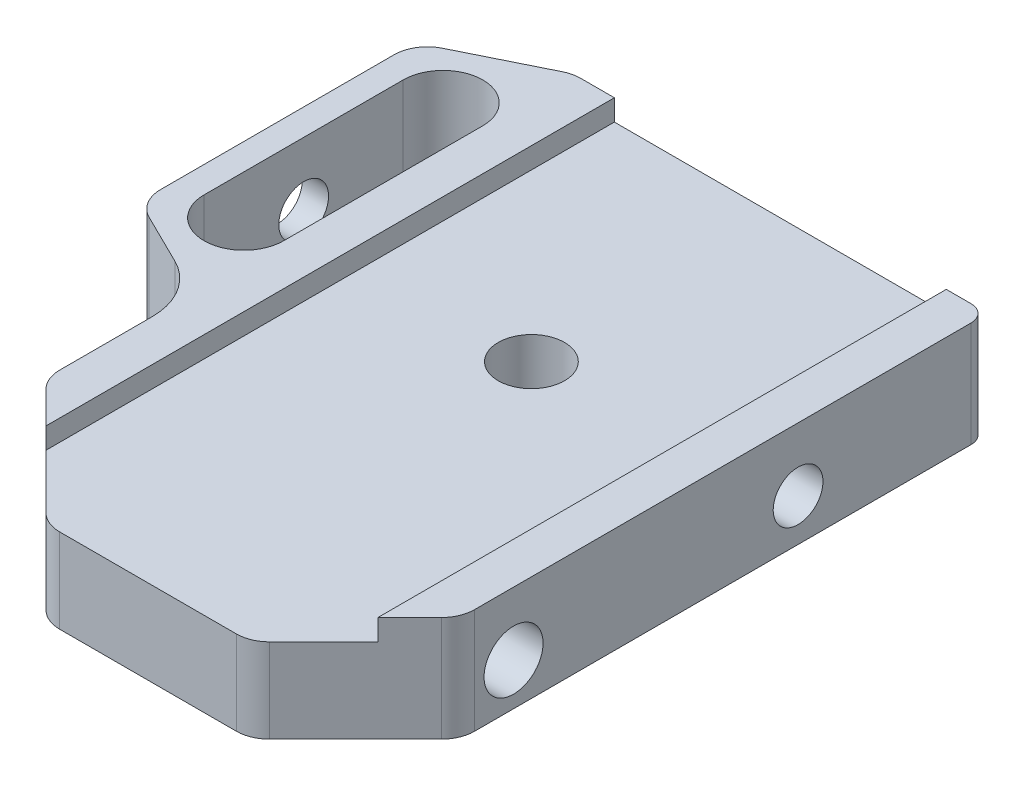
ISO-10303-21;
HEADER;
FILE_DESCRIPTION(('STEP AP214'),'2;1');
FILE_NAME('part.step','',(''),(''),'','','');
FILE_SCHEMA(('AUTOMOTIVE_DESIGN { 1 0 10303 214 1 1 1 1 }'));
ENDSEC;
DATA;
#1=APPLICATION_CONTEXT('core data for automotive mechanical design processes');
#2=APPLICATION_PROTOCOL_DEFINITION('international standard','automotive_design',2000,#1);
#3=PRODUCT_CONTEXT('',#1,'mechanical');
#4=PRODUCT('Part','Part','',(#3));
#5=PRODUCT_RELATED_PRODUCT_CATEGORY('part','',(#4));
#6=PRODUCT_DEFINITION_FORMATION('','',#4);
#7=PRODUCT_DEFINITION_CONTEXT('part definition',#1,'design');
#8=PRODUCT_DEFINITION('design','',#6,#7);
#9=PRODUCT_DEFINITION_SHAPE('','',#8);
#10=(LENGTH_UNIT() NAMED_UNIT(*) SI_UNIT(.MILLI.,.METRE.));
#11=(NAMED_UNIT(*) PLANE_ANGLE_UNIT() SI_UNIT($,.RADIAN.));
#12=(NAMED_UNIT(*) SI_UNIT($,.STERADIAN.) SOLID_ANGLE_UNIT());
#13=UNCERTAINTY_MEASURE_WITH_UNIT(LENGTH_MEASURE(1.E-05),#10,'distance_accuracy_value','');
#14=(GEOMETRIC_REPRESENTATION_CONTEXT(3) GLOBAL_UNCERTAINTY_ASSIGNED_CONTEXT((#13)) GLOBAL_UNIT_ASSIGNED_CONTEXT((#10,
#11,#12)) REPRESENTATION_CONTEXT('',''));
#15=CARTESIAN_POINT('',(0.,0.,0.));
#16=DIRECTION('',(0.,0.,1.));
#17=DIRECTION('',(1.,0.,0.));
#18=AXIS2_PLACEMENT_3D('',#15,#16,#17);
#19=CARTESIAN_POINT('',(0.,5.08,0.));
#20=DIRECTION('',(0.,1.,0.));
#21=DIRECTION('',(0.,0.,1.));
#22=AXIS2_PLACEMENT_3D('',#19,#20,#21);
#23=PLANE('',#22);
#24=CARTESIAN_POINT('',(12.5,5.08,15.));
#25=DIRECTION('',(0.,1.,0.));
#26=DIRECTION('',(0.,0.,1.));
#27=AXIS2_PLACEMENT_3D('',#24,#25,#26);
#28=CIRCLE('',#27,1.99999999999998);
#29=CARTESIAN_POINT('',(12.5,5.08,17.));
#30=VERTEX_POINT('',#29);
#31=EDGE_CURVE('E815',#30,#30,#28,.T.);
#32=ORIENTED_EDGE('',*,*,#31,.F.);
#33=EDGE_LOOP('',(#32));
#34=FACE_BOUND('',#33,.T.);
#35=DIRECTION('',(-0.707106781186549,0.,-0.707106781186546));
#36=VECTOR('',#35,1.);
#37=CARTESIAN_POINT('',(0.,5.08,31.75));
#38=LINE('',#37,#36);
#39=CARTESIAN_POINT('',(5.76421354362795,5.08,37.5142135436279));
#40=VERTEX_POINT('',#39);
#41=CARTESIAN_POINT('',(2.5,5.08,34.25));
#42=VERTEX_POINT('',#41);
#43=EDGE_CURVE('E297',#40,#42,#38,.T.);
#44=ORIENTED_EDGE('',*,*,#43,.F.);
#45=CARTESIAN_POINT('',(7.17842715125588,5.08,36.099999936));
#46=DIRECTION('',(0.,1.,0.));
#47=DIRECTION('',(0.,0.,1.));
#48=AXIS2_PLACEMENT_3D('',#45,#46,#47);
#49=CIRCLE('',#48,2.000000064);
#50=CARTESIAN_POINT('',(7.17842715125588,5.08,38.1));
#51=VERTEX_POINT('',#50);
#52=EDGE_CURVE('E379',#40,#51,#49,.T.);
#53=ORIENTED_EDGE('',*,*,#52,.T.);
#54=DIRECTION('',(-1.,0.,0.));
#55=VECTOR('',#54,1.);
#56=CARTESIAN_POINT('',(6.35000000000002,5.08,38.1));
#57=LINE('',#56,#55);
#58=CARTESIAN_POINT('',(17.8215728487441,5.08,38.1));
#59=VERTEX_POINT('',#58);
#60=EDGE_CURVE('E294',#59,#51,#57,.T.);
#61=ORIENTED_EDGE('',*,*,#60,.F.);
#62=CARTESIAN_POINT('',(17.8215728487441,5.08,36.099999936));
#63=DIRECTION('',(0.,1.,0.));
#64=DIRECTION('',(0.,0.,1.));
#65=AXIS2_PLACEMENT_3D('',#62,#63,#64);
#66=CIRCLE('',#65,2.000000064);
#67=CARTESIAN_POINT('',(19.2357864563721,5.08,37.5142135436279));
#68=VERTEX_POINT('',#67);
#69=EDGE_CURVE('E377',#59,#68,#66,.T.);
#70=ORIENTED_EDGE('',*,*,#69,.T.);
#71=DIRECTION('',(-0.707106781186546,0.,0.707106781186549));
#72=VECTOR('',#71,1.);
#73=CARTESIAN_POINT('',(18.65,5.08,38.1));
#74=LINE('',#73,#72);
#75=CARTESIAN_POINT('',(22.5,5.08,34.25));
#76=VERTEX_POINT('',#75);
#77=EDGE_CURVE('E266',#76,#68,#74,.T.);
#78=ORIENTED_EDGE('',*,*,#77,.F.);
#79=DIRECTION('',(0.,0.,1.));
#80=VECTOR('',#79,1.);
#81=CARTESIAN_POINT('',(22.5,5.08,34.25));
#82=LINE('',#81,#80);
#83=CARTESIAN_POINT('',(22.5,5.08,0.));
#84=VERTEX_POINT('',#83);
#85=EDGE_CURVE('E247',#84,#76,#82,.T.);
#86=ORIENTED_EDGE('',*,*,#85,.F.);
#87=DIRECTION('',(1.,0.,0.));
#88=VECTOR('',#87,1.);
#89=CARTESIAN_POINT('',(25.,5.08,0.));
#90=LINE('',#89,#88);
#91=CARTESIAN_POINT('',(2.5,5.08,0.));
#92=VERTEX_POINT('',#91);
#93=EDGE_CURVE('E271',#92,#84,#90,.T.);
#94=ORIENTED_EDGE('',*,*,#93,.F.);
#95=DIRECTION('',(0.,0.,-1.));
#96=VECTOR('',#95,1.);
#97=CARTESIAN_POINT('',(2.5,5.08,34.25));
#98=LINE('',#97,#96);
#99=EDGE_CURVE('E304',#42,#92,#98,.T.);
#100=ORIENTED_EDGE('',*,*,#99,.F.);
#101=EDGE_LOOP('',(#44,#53,#61,#70,#78,#86,#94,#100));
#102=FACE_BOUND('',#101,.T.);
#103=ADVANCED_FACE('F33',(#34,#102),#23,.T.);
#104=CARTESIAN_POINT('',(-6.38125,5.08,3.14672438243476));
#105=DIRECTION('',(-1.,0.,0.));
#106=DIRECTION('',(0.,0.,1.));
#107=AXIS2_PLACEMENT_3D('',#104,#105,#106);
#108=PLANE('',#107);
#109=CARTESIAN_POINT('',(-6.38125,2.54,11.43));
#110=DIRECTION('',(-1.,0.,0.));
#111=DIRECTION('',(0.,0.,1.));
#112=AXIS2_PLACEMENT_3D('',#109,#110,#111);
#113=CIRCLE('',#112,1.49999999999999);
#114=CARTESIAN_POINT('',(-6.38125,2.54,12.93));
#115=VERTEX_POINT('',#114);
#116=EDGE_CURVE('E802',#115,#115,#113,.T.);
#117=ORIENTED_EDGE('',*,*,#116,.F.);
#118=EDGE_LOOP('',(#117));
#119=FACE_BOUND('',#118,.T.);
#120=DIRECTION('',(0.,0.,1.));
#121=VECTOR('',#120,1.);
#122=CARTESIAN_POINT('',(-6.38125,6.35,3.14672438243476));
#123=LINE('',#122,#121);
#124=CARTESIAN_POINT('',(-6.38125,6.35,4.390432287151));
#125=VERTEX_POINT('',#124);
#126=CARTESIAN_POINT('',(-6.38125,6.35,18.469567712849));
#127=VERTEX_POINT('',#126);
#128=EDGE_CURVE('E311',#125,#127,#123,.T.);
#129=ORIENTED_EDGE('',*,*,#128,.F.);
#130=DIRECTION('',(0.,1.,0.));
#131=VECTOR('',#130,1.);
#132=CARTESIAN_POINT('',(-6.38125,5.08,4.390432287151));
#133=LINE('',#132,#131);
#134=CARTESIAN_POINT('',(-6.38125,0.,4.390432287151));
#135=VERTEX_POINT('',#134);
#136=EDGE_CURVE('E353',#125,#135,#133,.F.);
#137=ORIENTED_EDGE('',*,*,#136,.T.);
#138=DIRECTION('',(0.,0.,-1.));
#139=VECTOR('',#138,1.);
#140=CARTESIAN_POINT('',(-6.38125,0.,3.14672438243476));
#141=LINE('',#140,#139);
#142=CARTESIAN_POINT('',(-6.38125,0.,18.469567712849));
#143=VERTEX_POINT('',#142);
#144=EDGE_CURVE('E283',#143,#135,#141,.T.);
#145=ORIENTED_EDGE('',*,*,#144,.F.);
#146=DIRECTION('',(0.,-1.,0.));
#147=VECTOR('',#146,1.);
#148=CARTESIAN_POINT('',(-6.38125,5.08000000000001,18.469567712849));
#149=LINE('',#148,#147);
#150=EDGE_CURVE('E351',#143,#127,#149,.F.);
#151=ORIENTED_EDGE('',*,*,#150,.T.);
#152=EDGE_LOOP('',(#129,#137,#145,#151));
#153=FACE_BOUND('',#152,.T.);
#154=ADVANCED_FACE('F422',(#119,#153),#108,.T.);
#155=CARTESIAN_POINT('',(0.,5.08,0.));
#156=DIRECTION('',(-0.442270616264886,0.,-0.896881654394089));
#157=DIRECTION('',(-0.896881654394089,0.,0.442270616264887));
#158=AXIS2_PLACEMENT_3D('',#155,#156,#157);
#159=PLANE('',#158);
#160=DIRECTION('',(0.896881654394089,0.,-0.442270616264886));
#161=VECTOR('',#160,1.);
#162=CARTESIAN_POINT('',(0.,0.,0.));
#163=LINE('',#162,#161);
#164=CARTESIAN_POINT('',(-5.26579119683509,0.,2.5966689209624));
#165=VERTEX_POINT('',#164);
#166=CARTESIAN_POINT('',(-0.418227899226018,0.,0.206236697811397));
#167=VERTEX_POINT('',#166);
#168=EDGE_CURVE('E286',#165,#167,#163,.T.);
#169=ORIENTED_EDGE('',*,*,#168,.F.);
#170=DIRECTION('',(0.,1.,0.));
#171=VECTOR('',#170,1.);
#172=CARTESIAN_POINT('',(-5.26579119683509,5.08,2.5966689209624));
#173=LINE('',#172,#171);
#174=CARTESIAN_POINT('',(-5.26579119683509,6.35,2.5966689209624));
#175=VERTEX_POINT('',#174);
#176=EDGE_CURVE('E339',#165,#175,#173,.T.);
#177=ORIENTED_EDGE('',*,*,#176,.T.);
#178=DIRECTION('',(-0.896881654394089,0.,0.442270616264886));
#179=VECTOR('',#178,1.);
#180=CARTESIAN_POINT('',(0.,6.35,0.));
#181=LINE('',#180,#179);
#182=CARTESIAN_POINT('',(-0.418227899226019,6.35,0.206236697811396));
#183=VERTEX_POINT('',#182);
#184=EDGE_CURVE('E303',#183,#175,#181,.T.);
#185=ORIENTED_EDGE('',*,*,#184,.F.);
#186=DIRECTION('',(0.,1.,0.));
#187=VECTOR('',#186,1.);
#188=CARTESIAN_POINT('',(-0.418227899226019,5.08,0.206236697811396));
#189=LINE('',#188,#187);
#190=EDGE_CURVE('E337',#183,#167,#189,.F.);
#191=ORIENTED_EDGE('',*,*,#190,.T.);
#192=EDGE_LOOP('',(#169,#177,#185,#191));
#193=FACE_BOUND('',#192,.T.);
#194=ADVANCED_FACE('F430',(#193),#159,.T.);
#195=CARTESIAN_POINT('',(2.5,5.08,0.));
#196=DIRECTION('',(0.,0.,-1.));
#197=DIRECTION('',(-1.,0.,0.));
#198=AXIS2_PLACEMENT_3D('',#195,#196,#197);
#199=PLANE('',#198);
#200=DIRECTION('',(1.,0.,0.));
#201=VECTOR('',#200,1.);
#202=CARTESIAN_POINT('',(25.,0.,0.));
#203=LINE('',#202,#201);
#204=CARTESIAN_POINT('',(0.466313361609075,0.,0.));
#205=VERTEX_POINT('',#204);
#206=CARTESIAN_POINT('',(23.999999968,0.,0.));
#207=VERTEX_POINT('',#206);
#208=EDGE_CURVE('E289',#205,#207,#203,.T.);
#209=ORIENTED_EDGE('',*,*,#208,.F.);
#210=DIRECTION('',(0.,1.,0.));
#211=VECTOR('',#210,1.);
#212=CARTESIAN_POINT('',(0.466313361609075,5.08,0.));
#213=LINE('',#212,#211);
#214=CARTESIAN_POINT('',(0.466313361609075,6.35,0.));
#215=VERTEX_POINT('',#214);
#216=EDGE_CURVE('E398',#205,#215,#213,.T.);
#217=ORIENTED_EDGE('',*,*,#216,.T.);
#218=DIRECTION('',(-1.,0.,0.));
#219=VECTOR('',#218,1.);
#220=CARTESIAN_POINT('',(2.5,6.35,0.));
#221=LINE('',#220,#219);
#222=CARTESIAN_POINT('',(2.5,6.35,0.));
#223=VERTEX_POINT('',#222);
#224=EDGE_CURVE('E308',#223,#215,#221,.T.);
#225=ORIENTED_EDGE('',*,*,#224,.F.);
#226=DIRECTION('',(0.,1.,0.));
#227=VECTOR('',#226,1.);
#228=CARTESIAN_POINT('',(2.5,5.08,0.));
#229=LINE('',#228,#227);
#230=EDGE_CURVE('E321',#92,#223,#229,.T.);
#231=ORIENTED_EDGE('',*,*,#230,.F.);
#232=ORIENTED_EDGE('',*,*,#93,.T.);
#233=DIRECTION('',(0.,-1.,0.));
#234=VECTOR('',#233,1.);
#235=CARTESIAN_POINT('',(22.5,6.35,0.));
#236=LINE('',#235,#234);
#237=CARTESIAN_POINT('',(22.5,6.35,0.));
#238=VERTEX_POINT('',#237);
#239=EDGE_CURVE('E264',#238,#84,#236,.T.);
#240=ORIENTED_EDGE('',*,*,#239,.F.);
#241=DIRECTION('',(-1.,0.,0.));
#242=VECTOR('',#241,1.);
#243=CARTESIAN_POINT('',(22.5,6.35,0.));
#244=LINE('',#243,#242);
#245=CARTESIAN_POINT('',(23.999999968,6.35,0.));
#246=VERTEX_POINT('',#245);
#247=EDGE_CURVE('E253',#246,#238,#244,.T.);
#248=ORIENTED_EDGE('',*,*,#247,.F.);
#249=DIRECTION('',(0.,1.,0.));
#250=VECTOR('',#249,1.);
#251=CARTESIAN_POINT('',(23.999999968,0.,0.));
#252=LINE('',#251,#250);
#253=EDGE_CURVE('E332',#246,#207,#252,.F.);
#254=ORIENTED_EDGE('',*,*,#253,.T.);
#255=EDGE_LOOP('',(#209,#217,#225,#231,#232,#240,#248,#254));
#256=FACE_BOUND('',#255,.T.);
#257=ADVANCED_FACE('F438',(#256),#199,.T.);
#258=CARTESIAN_POINT('',(2.5,5.08,34.25));
#259=DIRECTION('',(1.,0.,0.));
#260=DIRECTION('',(0.,0.,-1.));
#261=AXIS2_PLACEMENT_3D('',#258,#259,#260);
#262=PLANE('',#261);
#263=DIRECTION('',(0.,0.,-1.));
#264=VECTOR('',#263,1.);
#265=CARTESIAN_POINT('',(2.5,6.35,34.25));
#266=LINE('',#265,#264);
#267=CARTESIAN_POINT('',(2.5,6.35,34.25));
#268=VERTEX_POINT('',#267);
#269=EDGE_CURVE('E316',#268,#223,#266,.T.);
#270=ORIENTED_EDGE('',*,*,#269,.F.);
#271=DIRECTION('',(0.,1.,0.));
#272=VECTOR('',#271,1.);
#273=CARTESIAN_POINT('',(2.5,5.08,34.25));
#274=LINE('',#273,#272);
#275=EDGE_CURVE('E307',#42,#268,#274,.T.);
#276=ORIENTED_EDGE('',*,*,#275,.F.);
#277=ORIENTED_EDGE('',*,*,#99,.T.);
#278=ORIENTED_EDGE('',*,*,#230,.T.);
#279=EDGE_LOOP('',(#270,#276,#277,#278));
#280=FACE_BOUND('',#279,.T.);
#281=ADVANCED_FACE('F519',(#280),#262,.T.);
#282=CARTESIAN_POINT('',(0.,5.08,31.75));
#283=DIRECTION('',(-0.707106781186546,0.,0.707106781186549));
#284=DIRECTION('',(0.707106781186549,0.,0.707106781186546));
#285=AXIS2_PLACEMENT_3D('',#282,#283,#284);
#286=PLANE('',#285);
#287=DIRECTION('',(0.707106781186549,0.,0.707106781186546));
#288=VECTOR('',#287,1.);
#289=CARTESIAN_POINT('',(0.,6.35,31.75));
#290=LINE('',#289,#288);
#291=CARTESIAN_POINT('',(0.585786456372073,6.35,32.3357864563721));
#292=VERTEX_POINT('',#291);
#293=EDGE_CURVE('E314',#292,#268,#290,.T.);
#294=ORIENTED_EDGE('',*,*,#293,.F.);
#295=DIRECTION('',(0.,1.,0.));
#296=VECTOR('',#295,1.);
#297=CARTESIAN_POINT('',(0.585786456372065,0.,32.3357864563721));
#298=LINE('',#297,#296);
#299=CARTESIAN_POINT('',(0.585786456372065,0.,32.3357864563721));
#300=VERTEX_POINT('',#299);
#301=EDGE_CURVE('E375',#292,#300,#298,.F.);
#302=ORIENTED_EDGE('',*,*,#301,.T.);
#303=DIRECTION('',(-0.707106781186549,0.,-0.707106781186546));
#304=VECTOR('',#303,1.);
#305=CARTESIAN_POINT('',(0.,0.,31.75));
#306=LINE('',#305,#304);
#307=CARTESIAN_POINT('',(5.76421354362795,0.,37.5142135436279));
#308=VERTEX_POINT('',#307);
#309=EDGE_CURVE('E277',#308,#300,#306,.T.);
#310=ORIENTED_EDGE('',*,*,#309,.F.);
#311=DIRECTION('',(0.,1.,0.));
#312=VECTOR('',#311,1.);
#313=CARTESIAN_POINT('',(5.76421354362795,5.08,37.5142135436279));
#314=LINE('',#313,#312);
#315=EDGE_CURVE('E372',#308,#40,#314,.T.);
#316=ORIENTED_EDGE('',*,*,#315,.T.);
#317=ORIENTED_EDGE('',*,*,#43,.T.);
#318=ORIENTED_EDGE('',*,*,#275,.T.);
#319=EDGE_LOOP('',(#294,#302,#310,#316,#317,#318));
#320=FACE_BOUND('',#319,.T.);
#321=ADVANCED_FACE('F480',(#320),#286,.T.);
#322=CARTESIAN_POINT('',(0.,6.35,0.));
#323=DIRECTION('',(0.,1.,0.));
#324=DIRECTION('',(0.,0.,1.));
#325=AXIS2_PLACEMENT_3D('',#322,#323,#324);
#326=PLANE('',#325);
#327=CARTESIAN_POINT('',(-2.396875,6.35,17.43));
#328=DIRECTION('',(0.,-1.,0.));
#329=DIRECTION('',(0.,0.,-1.));
#330=AXIS2_PLACEMENT_3D('',#327,#328,#329);
#331=CIRCLE('',#330,2.396875);
#332=CARTESIAN_POINT('',(0.,6.35,17.43));
#333=VERTEX_POINT('',#332);
#334=CARTESIAN_POINT('',(-4.79375,6.35,17.43));
#335=VERTEX_POINT('',#334);
#336=EDGE_CURVE('E209',#333,#335,#331,.T.);
#337=ORIENTED_EDGE('',*,*,#336,.T.);
#338=DIRECTION('',(0.,0.,-1.));
#339=VECTOR('',#338,1.);
#340=CARTESIAN_POINT('',(-4.79375,6.35,17.43));
#341=LINE('',#340,#339);
#342=CARTESIAN_POINT('',(-4.79375,6.35,5.43));
#343=VERTEX_POINT('',#342);
#344=EDGE_CURVE('E221',#335,#343,#341,.T.);
#345=ORIENTED_EDGE('',*,*,#344,.T.);
#346=CARTESIAN_POINT('',(-2.396875,6.35,5.43));
#347=DIRECTION('',(0.,-1.,0.));
#348=DIRECTION('',(0.,0.,-1.));
#349=AXIS2_PLACEMENT_3D('',#346,#347,#348);
#350=CIRCLE('',#349,2.396875);
#351=CARTESIAN_POINT('',(0.,6.35,5.43));
#352=VERTEX_POINT('',#351);
#353=EDGE_CURVE('E225',#343,#352,#350,.T.);
#354=ORIENTED_EDGE('',*,*,#353,.T.);
#355=DIRECTION('',(0.,0.,1.));
#356=VECTOR('',#355,1.);
#357=CARTESIAN_POINT('',(0.,6.35,5.43));
#358=LINE('',#357,#356);
#359=EDGE_CURVE('E217',#352,#333,#358,.T.);
#360=ORIENTED_EDGE('',*,*,#359,.T.);
#361=EDGE_LOOP('',(#337,#345,#354,#360));
#362=FACE_BOUND('',#361,.T.);
#363=ORIENTED_EDGE('',*,*,#184,.T.);
#364=CARTESIAN_POINT('',(-4.381249936,6.35,4.390432287151));
#365=DIRECTION('',(0.,1.,0.));
#366=DIRECTION('',(0.,0.,1.));
#367=AXIS2_PLACEMENT_3D('',#364,#365,#366);
#368=CIRCLE('',#367,2.000000064);
#369=EDGE_CURVE('E349',#175,#125,#368,.T.);
#370=ORIENTED_EDGE('',*,*,#369,.T.);
#371=ORIENTED_EDGE('',*,*,#128,.T.);
#372=CARTESIAN_POINT('',(-4.381249936,6.35,18.469567712849));
#373=DIRECTION('',(0.,1.,0.));
#374=DIRECTION('',(0.,0.,1.));
#375=AXIS2_PLACEMENT_3D('',#372,#373,#374);
#376=CIRCLE('',#375,2.000000064);
#377=CARTESIAN_POINT('',(-5.2657911968351,6.35,20.2633310790376));
#378=VERTEX_POINT('',#377);
#379=EDGE_CURVE('E344',#127,#378,#376,.T.);
#380=ORIENTED_EDGE('',*,*,#379,.T.);
#381=DIRECTION('',(-0.896881654394087,0.,-0.44227061626489));
#382=VECTOR('',#381,1.);
#383=CARTESIAN_POINT('',(0.,6.35,22.86));
#384=LINE('',#383,#382);
#385=CARTESIAN_POINT('',(-2.2309176063298,6.35,21.7598890770553));
#386=VERTEX_POINT('',#385);
#387=EDGE_CURVE('E291',#386,#378,#384,.T.);
#388=ORIENTED_EDGE('',*,*,#387,.F.);
#389=CARTESIAN_POINT('',(-4.000000128,6.35,25.3474158094325));
#390=DIRECTION('',(0.,1.,0.));
#391=DIRECTION('',(0.,0.,1.));
#392=AXIS2_PLACEMENT_3D('',#389,#390,#391);
#393=CIRCLE('',#392,4.000000128);
#394=CARTESIAN_POINT('',(0.,6.35,25.3474158094325));
#395=VERTEX_POINT('',#394);
#396=EDGE_CURVE('E41',#386,#395,#393,.F.);
#397=ORIENTED_EDGE('',*,*,#396,.T.);
#398=DIRECTION('',(0.,0.,1.));
#399=VECTOR('',#398,1.);
#400=CARTESIAN_POINT('',(0.,6.35,22.86));
#401=LINE('',#400,#399);
#402=CARTESIAN_POINT('',(0.,6.35,30.9215728487441));
#403=VERTEX_POINT('',#402);
#404=EDGE_CURVE('E301',#395,#403,#401,.T.);
#405=ORIENTED_EDGE('',*,*,#404,.T.);
#406=CARTESIAN_POINT('',(2.000000064,6.35,30.9215728487441));
#407=DIRECTION('',(0.,1.,0.));
#408=DIRECTION('',(0.,0.,1.));
#409=AXIS2_PLACEMENT_3D('',#406,#407,#408);
#410=CIRCLE('',#409,2.000000064);
#411=EDGE_CURVE('E347',#403,#292,#410,.T.);
#412=ORIENTED_EDGE('',*,*,#411,.T.);
#413=ORIENTED_EDGE('',*,*,#293,.T.);
#414=ORIENTED_EDGE('',*,*,#269,.T.);
#415=ORIENTED_EDGE('',*,*,#224,.T.);
#416=CARTESIAN_POINT('',(0.466313361609074,6.35,2.000000064));
#417=DIRECTION('',(0.,1.,0.));
#418=DIRECTION('',(0.,0.,1.));
#419=AXIS2_PLACEMENT_3D('',#416,#417,#418);
#420=CIRCLE('',#419,2.000000064);
#421=EDGE_CURVE('E342',#215,#183,#420,.T.);
#422=ORIENTED_EDGE('',*,*,#421,.T.);
#423=EDGE_LOOP('',(#363,#370,#371,#380,#388,#397,#405,#412,#413,#414,#415,#422));
#424=FACE_BOUND('',#423,.T.);
#425=ADVANCED_FACE('F227',(#362,#424),#326,.T.);
#426=CARTESIAN_POINT('',(0.,5.08,22.86));
#427=DIRECTION('',(1.,0.,0.));
#428=DIRECTION('',(0.,1.,0.));
#429=AXIS2_PLACEMENT_3D('',#426,#427,#428);
#430=PLANE('',#429);
#431=CARTESIAN_POINT('',(0.,2.54,28.575));
#432=DIRECTION('',(-1.,0.,0.));
#433=DIRECTION('',(0.,0.,1.));
#434=AXIS2_PLACEMENT_3D('',#431,#432,#433);
#435=CIRCLE('',#434,1.77799999999999);
#436=CARTESIAN_POINT('',(0.,2.54,30.353));
#437=VERTEX_POINT('',#436);
#438=EDGE_CURVE('E800',#437,#437,#435,.T.);
#439=ORIENTED_EDGE('',*,*,#438,.F.);
#440=EDGE_LOOP('',(#439));
#441=FACE_BOUND('',#440,.T.);
#442=ORIENTED_EDGE('',*,*,#404,.F.);
#443=DIRECTION('',(0.,1.,0.));
#444=VECTOR('',#443,1.);
#445=CARTESIAN_POINT('',(0.,5.08,25.3474158094325));
#446=LINE('',#445,#444);
#447=CARTESIAN_POINT('',(0.,0.,25.3474158094325));
#448=VERTEX_POINT('',#447);
#449=EDGE_CURVE('E54',#395,#448,#446,.F.);
#450=ORIENTED_EDGE('',*,*,#449,.T.);
#451=DIRECTION('',(0.,0.,-1.));
#452=VECTOR('',#451,1.);
#453=CARTESIAN_POINT('',(0.,0.,22.86));
#454=LINE('',#453,#452);
#455=CARTESIAN_POINT('',(0.,0.,30.9215728487441));
#456=VERTEX_POINT('',#455);
#457=EDGE_CURVE('E280',#456,#448,#454,.T.);
#458=ORIENTED_EDGE('',*,*,#457,.F.);
#459=DIRECTION('',(0.,1.,0.));
#460=VECTOR('',#459,1.);
#461=CARTESIAN_POINT('',(0.,6.35,30.9215728487441));
#462=LINE('',#461,#460);
#463=EDGE_CURVE('E369',#456,#403,#462,.T.);
#464=ORIENTED_EDGE('',*,*,#463,.T.);
#465=EDGE_LOOP('',(#442,#450,#458,#464));
#466=FACE_BOUND('',#465,.T.);
#467=ADVANCED_FACE('F487',(#441,#466),#430,.F.);
#468=CARTESIAN_POINT('',(0.,5.08,22.86));
#469=DIRECTION('',(-0.44227061626489,0.,0.896881654394087));
#470=DIRECTION('',(0.896881654394087,0.,0.44227061626489));
#471=AXIS2_PLACEMENT_3D('',#468,#469,#470);
#472=PLANE('',#471);
#473=DIRECTION('',(-0.896881654394087,0.,-0.44227061626489));
#474=VECTOR('',#473,1.);
#475=CARTESIAN_POINT('',(0.,0.,22.86));
#476=LINE('',#475,#474);
#477=CARTESIAN_POINT('',(-2.23091760632981,0.,21.7598890770553));
#478=VERTEX_POINT('',#477);
#479=CARTESIAN_POINT('',(-5.2657911968351,0.,20.2633310790376));
#480=VERTEX_POINT('',#479);
#481=EDGE_CURVE('E282',#478,#480,#476,.T.);
#482=ORIENTED_EDGE('',*,*,#481,.F.);
#483=DIRECTION('',(0.,1.,0.));
#484=VECTOR('',#483,1.);
#485=CARTESIAN_POINT('',(-2.2309176063298,5.08,21.7598890770553));
#486=LINE('',#485,#484);
#487=EDGE_CURVE('E401',#478,#386,#486,.T.);
#488=ORIENTED_EDGE('',*,*,#487,.T.);
#489=ORIENTED_EDGE('',*,*,#387,.T.);
#490=DIRECTION('',(0.,-1.,0.));
#491=VECTOR('',#490,1.);
#492=CARTESIAN_POINT('',(-5.2657911968351,5.08,20.2633310790376));
#493=LINE('',#492,#491);
#494=EDGE_CURVE('E386',#378,#480,#493,.T.);
#495=ORIENTED_EDGE('',*,*,#494,.T.);
#496=EDGE_LOOP('',(#482,#488,#489,#495));
#497=FACE_BOUND('',#496,.T.);
#498=ADVANCED_FACE('F407',(#497),#472,.T.);
#499=CARTESIAN_POINT('',(25.,0.,31.75));
#500=DIRECTION('',(-1.,0.,0.));
#501=DIRECTION('',(0.,0.,1.));
#502=AXIS2_PLACEMENT_3D('',#499,#500,#501);
#503=PLANE('',#502);
#504=CARTESIAN_POINT('',(25.,2.54,28.575));
#505=DIRECTION('',(-1.,0.,0.));
#506=DIRECTION('',(0.,0.,1.));
#507=AXIS2_PLACEMENT_3D('',#504,#505,#506);
#508=CIRCLE('',#507,1.77799999999998);
#509=CARTESIAN_POINT('',(25.,2.54,30.353));
#510=VERTEX_POINT('',#509);
#511=EDGE_CURVE('E797',#510,#510,#508,.T.);
#512=ORIENTED_EDGE('',*,*,#511,.T.);
#513=EDGE_LOOP('',(#512));
#514=FACE_BOUND('',#513,.T.);
#515=CARTESIAN_POINT('',(25.,2.54,11.43));
#516=DIRECTION('',(-1.,0.,0.));
#517=DIRECTION('',(0.,0.,1.));
#518=AXIS2_PLACEMENT_3D('',#515,#516,#517);
#519=CIRCLE('',#518,1.49999999999998);
#520=CARTESIAN_POINT('',(25.,2.54,12.93));
#521=VERTEX_POINT('',#520);
#522=EDGE_CURVE('E807',#521,#521,#519,.T.);
#523=ORIENTED_EDGE('',*,*,#522,.T.);
#524=EDGE_LOOP('',(#523));
#525=FACE_BOUND('',#524,.T.);
#526=DIRECTION('',(0.,0.,-1.));
#527=VECTOR('',#526,1.);
#528=CARTESIAN_POINT('',(25.,6.35,0.));
#529=LINE('',#528,#527);
#530=CARTESIAN_POINT('',(25.,6.35,30.9215728487441));
#531=VERTEX_POINT('',#530);
#532=CARTESIAN_POINT('',(25.,6.35,1.00000003200001));
#533=VERTEX_POINT('',#532);
#534=EDGE_CURVE('E251',#531,#533,#529,.T.);
#535=ORIENTED_EDGE('',*,*,#534,.F.);
#536=DIRECTION('',(0.,1.,0.));
#537=VECTOR('',#536,1.);
#538=CARTESIAN_POINT('',(25.,0.,30.9215728487441));
#539=LINE('',#538,#537);
#540=CARTESIAN_POINT('',(25.,0.,30.9215728487441));
#541=VERTEX_POINT('',#540);
#542=EDGE_CURVE('E396',#531,#541,#539,.F.);
#543=ORIENTED_EDGE('',*,*,#542,.T.);
#544=DIRECTION('',(0.,0.,1.));
#545=VECTOR('',#544,1.);
#546=CARTESIAN_POINT('',(25.,0.,31.75));
#547=LINE('',#546,#545);
#548=CARTESIAN_POINT('',(25.,0.,1.00000003200001));
#549=VERTEX_POINT('',#548);
#550=EDGE_CURVE('E267',#549,#541,#547,.T.);
#551=ORIENTED_EDGE('',*,*,#550,.F.);
#552=DIRECTION('',(0.,1.,0.));
#553=VECTOR('',#552,1.);
#554=CARTESIAN_POINT('',(25.,6.35,1.00000003200001));
#555=LINE('',#554,#553);
#556=EDGE_CURVE('E323',#549,#533,#555,.T.);
#557=ORIENTED_EDGE('',*,*,#556,.T.);
#558=EDGE_LOOP('',(#535,#543,#551,#557));
#559=FACE_BOUND('',#558,.T.);
#560=ADVANCED_FACE('F452',(#514,#525,#559),#503,.F.);
#561=CARTESIAN_POINT('',(18.65,0.,38.1));
#562=DIRECTION('',(-0.707106781186549,0.,-0.707106781186546));
#563=DIRECTION('',(-0.707106781186546,0.,0.707106781186549));
#564=AXIS2_PLACEMENT_3D('',#561,#562,#563);
#565=PLANE('',#564);
#566=ORIENTED_EDGE('',*,*,#77,.T.);
#567=DIRECTION('',(0.,1.,0.));
#568=VECTOR('',#567,1.);
#569=CARTESIAN_POINT('',(19.2357864563721,0.,37.5142135436279));
#570=LINE('',#569,#568);
#571=CARTESIAN_POINT('',(19.2357864563721,0.,37.5142135436279));
#572=VERTEX_POINT('',#571);
#573=EDGE_CURVE('E392',#68,#572,#570,.F.);
#574=ORIENTED_EDGE('',*,*,#573,.T.);
#575=DIRECTION('',(-0.707106781186546,0.,0.707106781186549));
#576=VECTOR('',#575,1.);
#577=CARTESIAN_POINT('',(18.65,0.,38.1));
#578=LINE('',#577,#576);
#579=CARTESIAN_POINT('',(24.4142135436279,0.,32.335786456372));
#580=VERTEX_POINT('',#579);
#581=EDGE_CURVE('E270',#580,#572,#578,.T.);
#582=ORIENTED_EDGE('',*,*,#581,.F.);
#583=DIRECTION('',(0.,1.,0.));
#584=VECTOR('',#583,1.);
#585=CARTESIAN_POINT('',(24.4142135436279,0.,32.335786456372));
#586=LINE('',#585,#584);
#587=CARTESIAN_POINT('',(24.4142135436279,6.35,32.335786456372));
#588=VERTEX_POINT('',#587);
#589=EDGE_CURVE('E389',#580,#588,#586,.T.);
#590=ORIENTED_EDGE('',*,*,#589,.T.);
#591=DIRECTION('',(0.707106781186545,0.,-0.707106781186549));
#592=VECTOR('',#591,1.);
#593=CARTESIAN_POINT('',(25.,6.35,31.75));
#594=LINE('',#593,#592);
#595=CARTESIAN_POINT('',(22.5,6.35,34.25));
#596=VERTEX_POINT('',#595);
#597=EDGE_CURVE('E257',#596,#588,#594,.T.);
#598=ORIENTED_EDGE('',*,*,#597,.F.);
#599=DIRECTION('',(0.,-1.,0.));
#600=VECTOR('',#599,1.);
#601=CARTESIAN_POINT('',(22.5,6.35,34.25));
#602=LINE('',#601,#600);
#603=EDGE_CURVE('E260',#596,#76,#602,.T.);
#604=ORIENTED_EDGE('',*,*,#603,.T.);
#605=EDGE_LOOP('',(#566,#574,#582,#590,#598,#604));
#606=FACE_BOUND('',#605,.T.);
#607=ADVANCED_FACE('F460',(#606),#565,.F.);
#608=CARTESIAN_POINT('',(6.35000000000002,0.,38.1));
#609=DIRECTION('',(0.,0.,-1.));
#610=DIRECTION('',(-1.,0.,0.));
#611=AXIS2_PLACEMENT_3D('',#608,#609,#610);
#612=PLANE('',#611);
#613=ORIENTED_EDGE('',*,*,#60,.T.);
#614=DIRECTION('',(0.,1.,0.));
#615=VECTOR('',#614,1.);
#616=CARTESIAN_POINT('',(7.17842715125588,0.,38.1));
#617=LINE('',#616,#615);
#618=CARTESIAN_POINT('',(7.17842715125588,0.,38.1));
#619=VERTEX_POINT('',#618);
#620=EDGE_CURVE('E384',#51,#619,#617,.F.);
#621=ORIENTED_EDGE('',*,*,#620,.T.);
#622=DIRECTION('',(-1.,0.,0.));
#623=VECTOR('',#622,1.);
#624=CARTESIAN_POINT('',(6.35000000000002,0.,38.1));
#625=LINE('',#624,#623);
#626=CARTESIAN_POINT('',(17.8215728487441,0.,38.1));
#627=VERTEX_POINT('',#626);
#628=EDGE_CURVE('E274',#627,#619,#625,.T.);
#629=ORIENTED_EDGE('',*,*,#628,.F.);
#630=DIRECTION('',(0.,1.,0.));
#631=VECTOR('',#630,1.);
#632=CARTESIAN_POINT('',(17.8215728487441,0.,38.1));
#633=LINE('',#632,#631);
#634=EDGE_CURVE('E381',#627,#59,#633,.T.);
#635=ORIENTED_EDGE('',*,*,#634,.T.);
#636=EDGE_LOOP('',(#613,#621,#629,#635));
#637=FACE_BOUND('',#636,.T.);
#638=ADVANCED_FACE('F470',(#637),#612,.F.);
#639=CARTESIAN_POINT('',(0.,0.,0.));
#640=DIRECTION('',(0.,1.,0.));
#641=DIRECTION('',(0.,0.,1.));
#642=AXIS2_PLACEMENT_3D('',#639,#640,#641);
#643=PLANE('',#642);
#644=CARTESIAN_POINT('',(12.5,0.,15.));
#645=DIRECTION('',(0.,1.,0.));
#646=DIRECTION('',(0.,0.,1.));
#647=AXIS2_PLACEMENT_3D('',#644,#645,#646);
#648=CIRCLE('',#647,1.99999999999998);
#649=CARTESIAN_POINT('',(12.5,0.,17.));
#650=VERTEX_POINT('',#649);
#651=EDGE_CURVE('E235',#650,#650,#648,.T.);
#652=ORIENTED_EDGE('',*,*,#651,.T.);
#653=EDGE_LOOP('',(#652));
#654=FACE_BOUND('',#653,.T.);
#655=DIRECTION('',(0.,0.,-1.));
#656=VECTOR('',#655,1.);
#657=CARTESIAN_POINT('',(-4.79375,0.,17.43));
#658=LINE('',#657,#656);
#659=CARTESIAN_POINT('',(-4.79375,0.,17.43));
#660=VERTEX_POINT('',#659);
#661=CARTESIAN_POINT('',(-4.79375,0.,5.43));
#662=VERTEX_POINT('',#661);
#663=EDGE_CURVE('E241',#660,#662,#658,.T.);
#664=ORIENTED_EDGE('',*,*,#663,.F.);
#665=CARTESIAN_POINT('',(-2.396875,0.,17.43));
#666=DIRECTION('',(0.,-1.,0.));
#667=DIRECTION('',(0.,0.,-1.));
#668=AXIS2_PLACEMENT_3D('',#665,#666,#667);
#669=CIRCLE('',#668,2.396875);
#670=CARTESIAN_POINT('',(0.,0.,17.43));
#671=VERTEX_POINT('',#670);
#672=EDGE_CURVE('E212',#671,#660,#669,.T.);
#673=ORIENTED_EDGE('',*,*,#672,.F.);
#674=DIRECTION('',(0.,0.,1.));
#675=VECTOR('',#674,1.);
#676=CARTESIAN_POINT('',(0.,0.,5.43));
#677=LINE('',#676,#675);
#678=CARTESIAN_POINT('',(0.,0.,5.43));
#679=VERTEX_POINT('',#678);
#680=EDGE_CURVE('E229',#679,#671,#677,.T.);
#681=ORIENTED_EDGE('',*,*,#680,.F.);
#682=CARTESIAN_POINT('',(-2.396875,0.,5.43));
#683=DIRECTION('',(0.,-1.,0.));
#684=DIRECTION('',(0.,0.,-1.));
#685=AXIS2_PLACEMENT_3D('',#682,#683,#684);
#686=CIRCLE('',#685,2.396875);
#687=EDGE_CURVE('E232',#662,#679,#686,.T.);
#688=ORIENTED_EDGE('',*,*,#687,.F.);
#689=EDGE_LOOP('',(#664,#673,#681,#688));
#690=FACE_BOUND('',#689,.T.);
#691=ORIENTED_EDGE('',*,*,#144,.T.);
#692=CARTESIAN_POINT('',(-4.381249936,0.,4.390432287151));
#693=DIRECTION('',(0.,1.,0.));
#694=DIRECTION('',(0.,0.,1.));
#695=AXIS2_PLACEMENT_3D('',#692,#693,#694);
#696=CIRCLE('',#695,2.000000064);
#697=EDGE_CURVE('E367',#135,#165,#696,.F.);
#698=ORIENTED_EDGE('',*,*,#697,.T.);
#699=ORIENTED_EDGE('',*,*,#168,.T.);
#700=CARTESIAN_POINT('',(0.466313361609074,0.,2.000000064));
#701=DIRECTION('',(0.,1.,0.));
#702=DIRECTION('',(0.,0.,1.));
#703=AXIS2_PLACEMENT_3D('',#700,#701,#702);
#704=CIRCLE('',#703,2.000000064);
#705=EDGE_CURVE('E355',#167,#205,#704,.F.);
#706=ORIENTED_EDGE('',*,*,#705,.T.);
#707=ORIENTED_EDGE('',*,*,#208,.T.);
#708=CARTESIAN_POINT('',(23.999999968,0.,1.00000003200001));
#709=DIRECTION('',(0.,1.,0.));
#710=DIRECTION('',(0.,0.,1.));
#711=AXIS2_PLACEMENT_3D('',#708,#709,#710);
#712=CIRCLE('',#711,1.000000032);
#713=EDGE_CURVE('E335',#207,#549,#712,.F.);
#714=ORIENTED_EDGE('',*,*,#713,.T.);
#715=ORIENTED_EDGE('',*,*,#550,.T.);
#716=CARTESIAN_POINT('',(22.999999936,0.,30.9215728487441));
#717=DIRECTION('',(0.,1.,0.));
#718=DIRECTION('',(0.,0.,1.));
#719=AXIS2_PLACEMENT_3D('',#716,#717,#718);
#720=CIRCLE('',#719,2.000000064);
#721=EDGE_CURVE('E357',#541,#580,#720,.F.);
#722=ORIENTED_EDGE('',*,*,#721,.T.);
#723=ORIENTED_EDGE('',*,*,#581,.T.);
#724=CARTESIAN_POINT('',(17.8215728487441,0.,36.099999936));
#725=DIRECTION('',(0.,1.,0.));
#726=DIRECTION('',(0.,0.,1.));
#727=AXIS2_PLACEMENT_3D('',#724,#725,#726);
#728=CIRCLE('',#727,2.000000064);
#729=EDGE_CURVE('E359',#572,#627,#728,.F.);
#730=ORIENTED_EDGE('',*,*,#729,.T.);
#731=ORIENTED_EDGE('',*,*,#628,.T.);
#732=CARTESIAN_POINT('',(7.17842715125588,0.,36.099999936));
#733=DIRECTION('',(0.,1.,0.));
#734=DIRECTION('',(0.,0.,1.));
#735=AXIS2_PLACEMENT_3D('',#732,#733,#734);
#736=CIRCLE('',#735,2.000000064);
#737=EDGE_CURVE('E363',#619,#308,#736,.F.);
#738=ORIENTED_EDGE('',*,*,#737,.T.);
#739=ORIENTED_EDGE('',*,*,#309,.T.);
#740=CARTESIAN_POINT('',(2.00000006399999,0.,30.9215728487441));
#741=DIRECTION('',(0.,1.,0.));
#742=DIRECTION('',(0.,0.,1.));
#743=AXIS2_PLACEMENT_3D('',#740,#741,#742);
#744=CIRCLE('',#743,2.000000064);
#745=EDGE_CURVE('E365',#300,#456,#744,.F.);
#746=ORIENTED_EDGE('',*,*,#745,.T.);
#747=ORIENTED_EDGE('',*,*,#457,.T.);
#748=CARTESIAN_POINT('',(-4.00000012800001,0.,25.3474158094325));
#749=DIRECTION('',(0.,1.,0.));
#750=DIRECTION('',(0.,0.,1.));
#751=AXIS2_PLACEMENT_3D('',#748,#749,#750);
#752=CIRCLE('',#751,4.000000128);
#753=EDGE_CURVE('E11',#448,#478,#752,.T.);
#754=ORIENTED_EDGE('',*,*,#753,.T.);
#755=ORIENTED_EDGE('',*,*,#481,.T.);
#756=CARTESIAN_POINT('',(-4.381249936,0.,18.469567712849));
#757=DIRECTION('',(0.,1.,0.));
#758=DIRECTION('',(0.,0.,1.));
#759=AXIS2_PLACEMENT_3D('',#756,#757,#758);
#760=CIRCLE('',#759,2.000000064);
#761=EDGE_CURVE('E361',#480,#143,#760,.F.);
#762=ORIENTED_EDGE('',*,*,#761,.T.);
#763=EDGE_LOOP('',(#691,#698,#699,#706,#707,#714,#715,#722,#723,#730,#731,#738,#739,#746,#747,
#754,#755,#762));
#764=FACE_BOUND('',#763,.T.);
#765=ADVANCED_FACE('F419',(#654,#690,#764),#643,.F.);
#766=CARTESIAN_POINT('',(22.5,6.35,34.25));
#767=DIRECTION('',(1.,0.,0.));
#768=DIRECTION('',(0.,0.,-1.));
#769=AXIS2_PLACEMENT_3D('',#766,#767,#768);
#770=PLANE('',#769);
#771=ORIENTED_EDGE('',*,*,#85,.T.);
#772=ORIENTED_EDGE('',*,*,#603,.F.);
#773=DIRECTION('',(0.,0.,1.));
#774=VECTOR('',#773,1.);
#775=CARTESIAN_POINT('',(22.5,6.35,34.25));
#776=LINE('',#775,#774);
#777=EDGE_CURVE('E255',#238,#596,#776,.T.);
#778=ORIENTED_EDGE('',*,*,#777,.F.);
#779=ORIENTED_EDGE('',*,*,#239,.T.);
#780=EDGE_LOOP('',(#771,#772,#778,#779));
#781=FACE_BOUND('',#780,.T.);
#782=ADVANCED_FACE('F584',(#781),#770,.F.);
#783=CARTESIAN_POINT('',(0.,6.35,0.));
#784=DIRECTION('',(0.,1.,0.));
#785=DIRECTION('',(0.,0.,1.));
#786=AXIS2_PLACEMENT_3D('',#783,#784,#785);
#787=PLANE('',#786);
#788=ORIENTED_EDGE('',*,*,#597,.T.);
#789=CARTESIAN_POINT('',(22.999999936,6.35,30.9215728487441));
#790=DIRECTION('',(0.,1.,0.));
#791=DIRECTION('',(0.,0.,1.));
#792=AXIS2_PLACEMENT_3D('',#789,#790,#791);
#793=CIRCLE('',#792,2.000000064);
#794=EDGE_CURVE('E394',#588,#531,#793,.T.);
#795=ORIENTED_EDGE('',*,*,#794,.T.);
#796=ORIENTED_EDGE('',*,*,#534,.T.);
#797=CARTESIAN_POINT('',(23.999999968,6.35,1.00000003200001));
#798=DIRECTION('',(0.,1.,0.));
#799=DIRECTION('',(0.,0.,1.));
#800=AXIS2_PLACEMENT_3D('',#797,#798,#799);
#801=CIRCLE('',#800,1.000000032);
#802=EDGE_CURVE('E330',#533,#246,#801,.T.);
#803=ORIENTED_EDGE('',*,*,#802,.T.);
#804=ORIENTED_EDGE('',*,*,#247,.T.);
#805=ORIENTED_EDGE('',*,*,#777,.T.);
#806=EDGE_LOOP('',(#788,#795,#796,#803,#804,#805));
#807=FACE_BOUND('',#806,.T.);
#808=ADVANCED_FACE('F600',(#807),#787,.T.);
#809=CARTESIAN_POINT('',(-2.396875,6.35,17.43));
#810=DIRECTION('',(0.,-1.,0.));
#811=DIRECTION('',(0.,0.,-1.));
#812=AXIS2_PLACEMENT_3D('',#809,#810,#811);
#813=CYLINDRICAL_SURFACE('',#812,2.396875);
#814=ORIENTED_EDGE('',*,*,#672,.T.);
#815=DIRECTION('',(0.,-1.,0.));
#816=VECTOR('',#815,1.);
#817=CARTESIAN_POINT('',(-4.79375,6.35,17.43));
#818=LINE('',#817,#816);
#819=EDGE_CURVE('E205',#335,#660,#818,.T.);
#820=ORIENTED_EDGE('',*,*,#819,.F.);
#821=ORIENTED_EDGE('',*,*,#336,.F.);
#822=DIRECTION('',(0.,-1.,0.));
#823=VECTOR('',#822,1.);
#824=CARTESIAN_POINT('',(0.,6.35,17.43));
#825=LINE('',#824,#823);
#826=EDGE_CURVE('E245',#333,#671,#825,.T.);
#827=ORIENTED_EDGE('',*,*,#826,.T.);
#828=EDGE_LOOP('',(#814,#820,#821,#827));
#829=FACE_BOUND('',#828,.T.);
#830=ADVANCED_FACE('F207',(#829),#813,.F.);
#831=CARTESIAN_POINT('',(0.,6.35,5.43));
#832=DIRECTION('',(1.,0.,0.));
#833=DIRECTION('',(0.,0.,-1.));
#834=AXIS2_PLACEMENT_3D('',#831,#832,#833);
#835=PLANE('',#834);
#836=CARTESIAN_POINT('',(0.,2.54,11.43));
#837=DIRECTION('',(1.,0.,0.));
#838=DIRECTION('',(0.,0.,-1.));
#839=AXIS2_PLACEMENT_3D('',#836,#837,#838);
#840=CIRCLE('',#839,1.49999999999998);
#841=CARTESIAN_POINT('',(0.,2.54,9.93000000000001));
#842=VERTEX_POINT('',#841);
#843=EDGE_CURVE('E813',#842,#842,#840,.T.);
#844=ORIENTED_EDGE('',*,*,#843,.T.);
#845=EDGE_LOOP('',(#844));
#846=FACE_BOUND('',#845,.T.);
#847=ORIENTED_EDGE('',*,*,#680,.T.);
#848=ORIENTED_EDGE('',*,*,#826,.F.);
#849=ORIENTED_EDGE('',*,*,#359,.F.);
#850=DIRECTION('',(0.,-1.,0.));
#851=VECTOR('',#850,1.);
#852=CARTESIAN_POINT('',(0.,6.35,5.43));
#853=LINE('',#852,#851);
#854=EDGE_CURVE('E248',#352,#679,#853,.T.);
#855=ORIENTED_EDGE('',*,*,#854,.T.);
#856=EDGE_LOOP('',(#847,#848,#849,#855));
#857=FACE_BOUND('',#856,.T.);
#858=ADVANCED_FACE('F616',(#846,#857),#835,.F.);
#859=CARTESIAN_POINT('',(-2.396875,6.35,5.43));
#860=DIRECTION('',(0.,-1.,0.));
#861=DIRECTION('',(0.,0.,-1.));
#862=AXIS2_PLACEMENT_3D('',#859,#860,#861);
#863=CYLINDRICAL_SURFACE('',#862,2.396875);
#864=ORIENTED_EDGE('',*,*,#687,.T.);
#865=ORIENTED_EDGE('',*,*,#854,.F.);
#866=ORIENTED_EDGE('',*,*,#353,.F.);
#867=DIRECTION('',(0.,-1.,0.));
#868=VECTOR('',#867,1.);
#869=CARTESIAN_POINT('',(-4.79375,6.35,5.43));
#870=LINE('',#869,#868);
#871=EDGE_CURVE('E216',#343,#662,#870,.T.);
#872=ORIENTED_EDGE('',*,*,#871,.T.);
#873=EDGE_LOOP('',(#864,#865,#866,#872));
#874=FACE_BOUND('',#873,.T.);
#875=ADVANCED_FACE('F624',(#874),#863,.F.);
#876=CARTESIAN_POINT('',(-4.79375,6.35,17.43));
#877=DIRECTION('',(-1.,0.,0.));
#878=DIRECTION('',(0.,0.,1.));
#879=AXIS2_PLACEMENT_3D('',#876,#877,#878);
#880=PLANE('',#879);
#881=CARTESIAN_POINT('',(-4.79375,2.54,11.43));
#882=DIRECTION('',(-1.,0.,0.));
#883=DIRECTION('',(0.,0.,1.));
#884=AXIS2_PLACEMENT_3D('',#881,#882,#883);
#885=CIRCLE('',#884,1.49999999999998);
#886=CARTESIAN_POINT('',(-4.79375,2.54,12.93));
#887=VERTEX_POINT('',#886);
#888=EDGE_CURVE('E810',#887,#887,#885,.T.);
#889=ORIENTED_EDGE('',*,*,#888,.T.);
#890=EDGE_LOOP('',(#889));
#891=FACE_BOUND('',#890,.T.);
#892=ORIENTED_EDGE('',*,*,#663,.T.);
#893=ORIENTED_EDGE('',*,*,#871,.F.);
#894=ORIENTED_EDGE('',*,*,#344,.F.);
#895=ORIENTED_EDGE('',*,*,#819,.T.);
#896=EDGE_LOOP('',(#892,#893,#894,#895));
#897=FACE_BOUND('',#896,.T.);
#898=ADVANCED_FACE('F222',(#891,#897),#880,.F.);
#899=CARTESIAN_POINT('',(12.5,5.08,15.));
#900=DIRECTION('',(0.,1.,0.));
#901=DIRECTION('',(0.,0.,1.));
#902=AXIS2_PLACEMENT_3D('',#899,#900,#901);
#903=CYLINDRICAL_SURFACE('',#902,1.99999999999998);
#904=ORIENTED_EDGE('',*,*,#651,.F.);
#905=EDGE_LOOP('',(#904));
#906=FACE_BOUND('',#905,.T.);
#907=ORIENTED_EDGE('',*,*,#31,.T.);
#908=EDGE_LOOP('',(#907));
#909=FACE_BOUND('',#908,.T.);
#910=ADVANCED_FACE('F639',(#906,#909),#903,.F.);
#911=CARTESIAN_POINT('',(-6.38125,2.54,11.43));
#912=DIRECTION('',(-1.,0.,0.));
#913=DIRECTION('',(0.,0.,1.));
#914=AXIS2_PLACEMENT_3D('',#911,#912,#913);
#915=CYLINDRICAL_SURFACE('',#914,1.49999999999998);
#916=ORIENTED_EDGE('',*,*,#116,.T.);
#917=EDGE_LOOP('',(#916));
#918=FACE_BOUND('',#917,.T.);
#919=ORIENTED_EDGE('',*,*,#888,.F.);
#920=EDGE_LOOP('',(#919));
#921=FACE_BOUND('',#920,.T.);
#922=ADVANCED_FACE('F647',(#918,#921),#915,.F.);
#923=ORIENTED_EDGE('',*,*,#522,.F.);
#924=EDGE_LOOP('',(#923));
#925=FACE_BOUND('',#924,.T.);
#926=ORIENTED_EDGE('',*,*,#843,.F.);
#927=EDGE_LOOP('',(#926));
#928=FACE_BOUND('',#927,.T.);
#929=ADVANCED_FACE('F654',(#925,#928),#915,.F.);
#930=CARTESIAN_POINT('',(0.,2.54,28.575));
#931=DIRECTION('',(-1.,0.,0.));
#932=DIRECTION('',(0.,0.,1.));
#933=AXIS2_PLACEMENT_3D('',#930,#931,#932);
#934=CYLINDRICAL_SURFACE('',#933,1.77799999999998);
#935=ORIENTED_EDGE('',*,*,#511,.F.);
#936=EDGE_LOOP('',(#935));
#937=FACE_BOUND('',#936,.T.);
#938=ORIENTED_EDGE('',*,*,#438,.T.);
#939=EDGE_LOOP('',(#938));
#940=FACE_BOUND('',#939,.T.);
#941=ADVANCED_FACE('F531',(#937,#940),#934,.F.);
#942=CARTESIAN_POINT('',(23.999999968,0.,1.00000003200001));
#943=DIRECTION('',(0.,-1.,0.));
#944=DIRECTION('',(0.,0.,-1.));
#945=AXIS2_PLACEMENT_3D('',#942,#943,#944);
#946=CYLINDRICAL_SURFACE('',#945,1.000000032);
#947=ORIENTED_EDGE('',*,*,#713,.F.);
#948=ORIENTED_EDGE('',*,*,#253,.F.);
#949=ORIENTED_EDGE('',*,*,#802,.F.);
#950=ORIENTED_EDGE('',*,*,#556,.F.);
#951=EDGE_LOOP('',(#947,#948,#949,#950));
#952=FACE_BOUND('',#951,.T.);
#953=ADVANCED_FACE('F447',(#952),#946,.T.);
#954=CARTESIAN_POINT('',(-4.381249936,5.08,4.390432287151));
#955=DIRECTION('',(0.,1.,0.));
#956=DIRECTION('',(0.,0.,1.));
#957=AXIS2_PLACEMENT_3D('',#954,#955,#956);
#958=CYLINDRICAL_SURFACE('',#957,2.000000064);
#959=ORIENTED_EDGE('',*,*,#697,.F.);
#960=ORIENTED_EDGE('',*,*,#136,.F.);
#961=ORIENTED_EDGE('',*,*,#369,.F.);
#962=ORIENTED_EDGE('',*,*,#176,.F.);
#963=EDGE_LOOP('',(#959,#960,#961,#962));
#964=FACE_BOUND('',#963,.T.);
#965=ADVANCED_FACE('F425',(#964),#958,.T.);
#966=CARTESIAN_POINT('',(2.000000064,5.07999999999999,30.9215728487441));
#967=DIRECTION('',(0.,-1.,0.));
#968=DIRECTION('',(1.,0.,0.));
#969=AXIS2_PLACEMENT_3D('',#966,#967,#968);
#970=CYLINDRICAL_SURFACE('',#969,2.000000064);
#971=ORIENTED_EDGE('',*,*,#745,.F.);
#972=ORIENTED_EDGE('',*,*,#301,.F.);
#973=ORIENTED_EDGE('',*,*,#411,.F.);
#974=ORIENTED_EDGE('',*,*,#463,.F.);
#975=EDGE_LOOP('',(#971,#972,#973,#974));
#976=FACE_BOUND('',#975,.T.);
#977=ADVANCED_FACE('F485',(#976),#970,.T.);
#978=CARTESIAN_POINT('',(7.17842715125588,5.08,36.099999936));
#979=DIRECTION('',(0.,-1.,0.));
#980=DIRECTION('',(0.,0.,-1.));
#981=AXIS2_PLACEMENT_3D('',#978,#979,#980);
#982=CYLINDRICAL_SURFACE('',#981,2.000000064);
#983=ORIENTED_EDGE('',*,*,#737,.F.);
#984=ORIENTED_EDGE('',*,*,#620,.F.);
#985=ORIENTED_EDGE('',*,*,#52,.F.);
#986=ORIENTED_EDGE('',*,*,#315,.F.);
#987=EDGE_LOOP('',(#983,#984,#985,#986));
#988=FACE_BOUND('',#987,.T.);
#989=ADVANCED_FACE('F474',(#988),#982,.T.);
#990=CARTESIAN_POINT('',(-4.381249936,5.08,18.469567712849));
#991=DIRECTION('',(0.,-1.,0.));
#992=DIRECTION('',(0.,0.,-1.));
#993=AXIS2_PLACEMENT_3D('',#990,#991,#992);
#994=CYLINDRICAL_SURFACE('',#993,2.000000064);
#995=ORIENTED_EDGE('',*,*,#379,.F.);
#996=ORIENTED_EDGE('',*,*,#150,.F.);
#997=ORIENTED_EDGE('',*,*,#761,.F.);
#998=ORIENTED_EDGE('',*,*,#494,.F.);
#999=EDGE_LOOP('',(#995,#996,#997,#998));
#1000=FACE_BOUND('',#999,.T.);
#1001=ADVANCED_FACE('F416',(#1000),#994,.T.);
#1002=CARTESIAN_POINT('',(17.8215728487441,0.,36.099999936));
#1003=DIRECTION('',(0.,1.,0.));
#1004=DIRECTION('',(0.,0.,1.));
#1005=AXIS2_PLACEMENT_3D('',#1002,#1003,#1004);
#1006=CYLINDRICAL_SURFACE('',#1005,2.000000064);
#1007=ORIENTED_EDGE('',*,*,#729,.F.);
#1008=ORIENTED_EDGE('',*,*,#573,.F.);
#1009=ORIENTED_EDGE('',*,*,#69,.F.);
#1010=ORIENTED_EDGE('',*,*,#634,.F.);
#1011=EDGE_LOOP('',(#1007,#1008,#1009,#1010));
#1012=FACE_BOUND('',#1011,.T.);
#1013=ADVANCED_FACE('F465',(#1012),#1006,.T.);
#1014=CARTESIAN_POINT('',(22.999999936,0.,30.9215728487441));
#1015=DIRECTION('',(0.,1.,0.));
#1016=DIRECTION('',(0.,0.,1.));
#1017=AXIS2_PLACEMENT_3D('',#1014,#1015,#1016);
#1018=CYLINDRICAL_SURFACE('',#1017,2.000000064);
#1019=ORIENTED_EDGE('',*,*,#721,.F.);
#1020=ORIENTED_EDGE('',*,*,#542,.F.);
#1021=ORIENTED_EDGE('',*,*,#794,.F.);
#1022=ORIENTED_EDGE('',*,*,#589,.F.);
#1023=EDGE_LOOP('',(#1019,#1020,#1021,#1022));
#1024=FACE_BOUND('',#1023,.T.);
#1025=ADVANCED_FACE('F455',(#1024),#1018,.T.);
#1026=CARTESIAN_POINT('',(0.466313361609074,5.08,2.000000064));
#1027=DIRECTION('',(0.,1.,0.));
#1028=DIRECTION('',(0.,0.,1.));
#1029=AXIS2_PLACEMENT_3D('',#1026,#1027,#1028);
#1030=CYLINDRICAL_SURFACE('',#1029,2.000000064);
#1031=ORIENTED_EDGE('',*,*,#705,.F.);
#1032=ORIENTED_EDGE('',*,*,#190,.F.);
#1033=ORIENTED_EDGE('',*,*,#421,.F.);
#1034=ORIENTED_EDGE('',*,*,#216,.F.);
#1035=EDGE_LOOP('',(#1031,#1032,#1033,#1034));
#1036=FACE_BOUND('',#1035,.T.);
#1037=ADVANCED_FACE('F434',(#1036),#1030,.T.);
#1038=CARTESIAN_POINT('',(-4.000000128,5.08000000000001,25.3474158094325));
#1039=DIRECTION('',(0.,1.,0.));
#1040=DIRECTION('',(-1.,0.,0.));
#1041=AXIS2_PLACEMENT_3D('',#1038,#1039,#1040);
#1042=CYLINDRICAL_SURFACE('',#1041,4.000000128);
#1043=ORIENTED_EDGE('',*,*,#753,.F.);
#1044=ORIENTED_EDGE('',*,*,#449,.F.);
#1045=ORIENTED_EDGE('',*,*,#396,.F.);
#1046=ORIENTED_EDGE('',*,*,#487,.F.);
#1047=EDGE_LOOP('',(#1043,#1044,#1045,#1046));
#1048=FACE_BOUND('',#1047,.T.);
#1049=ADVANCED_FACE('F35',(#1048),#1042,.F.);
#1050=CLOSED_SHELL('',(#103,#154,#194,#257,#281,#321,#425,#467,#498,#560,#607,#638,#765,#782,
#808,#830,#858,#875,#898,#910,#922,#929,#941,#953,#965,#977,#989,#1001,#1013,#1025,#1037,#1049));
#1051=MANIFOLD_SOLID_BREP('B2',#1050);
#1052=ADVANCED_BREP_SHAPE_REPRESENTATION('',(#18,#1051),#14);
#1053=SHAPE_DEFINITION_REPRESENTATION(#9,#1052);
ENDSEC;
END-ISO-10303-21;
